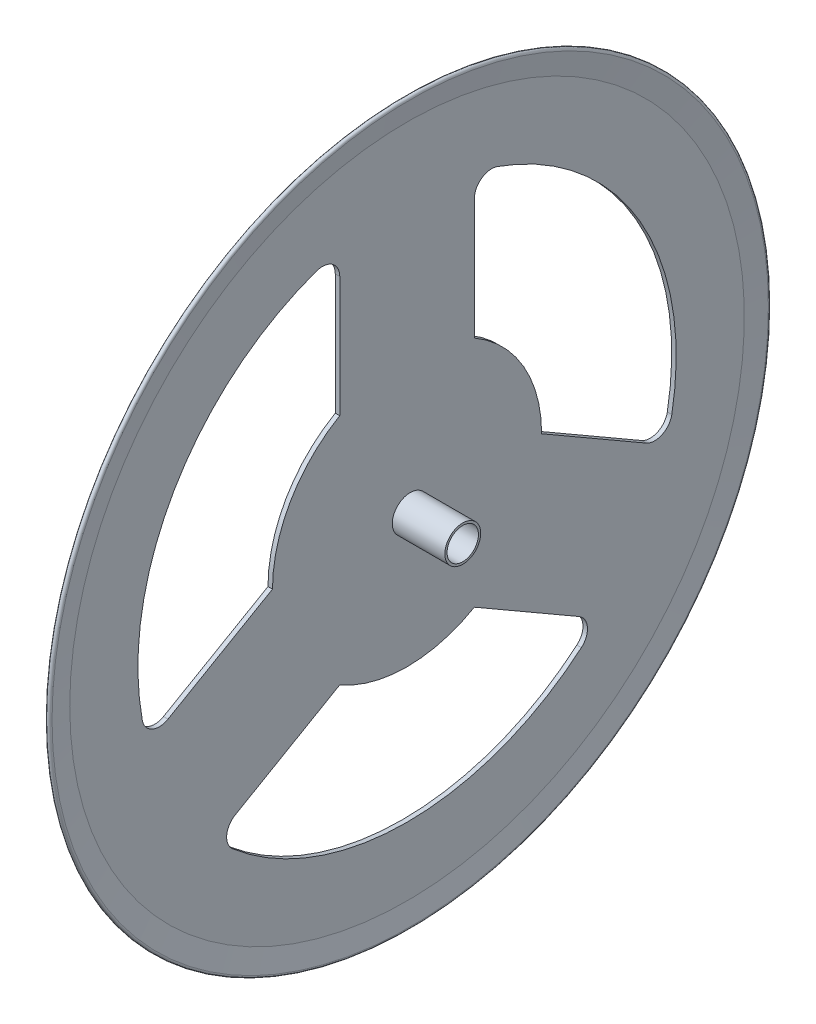
ISO-10303-21;
HEADER;
FILE_DESCRIPTION(('STEP AP214'),'2;1');
FILE_NAME('part.step','',(''),(''),'','','');
FILE_SCHEMA(('AUTOMOTIVE_DESIGN { 1 0 10303 214 1 1 1 1 }'));
ENDSEC;
DATA;
#1=APPLICATION_CONTEXT('core data for automotive mechanical design processes');
#2=APPLICATION_PROTOCOL_DEFINITION('international standard','automotive_design',2000,#1);
#3=PRODUCT_CONTEXT('',#1,'mechanical');
#4=PRODUCT('Part','Part','',(#3));
#5=PRODUCT_RELATED_PRODUCT_CATEGORY('part','',(#4));
#6=PRODUCT_DEFINITION_FORMATION('','',#4);
#7=PRODUCT_DEFINITION_CONTEXT('part definition',#1,'design');
#8=PRODUCT_DEFINITION('design','',#6,#7);
#9=PRODUCT_DEFINITION_SHAPE('','',#8);
#10=(LENGTH_UNIT() NAMED_UNIT(*) SI_UNIT(.MILLI.,.METRE.));
#11=(NAMED_UNIT(*) PLANE_ANGLE_UNIT() SI_UNIT($,.RADIAN.));
#12=(NAMED_UNIT(*) SI_UNIT($,.STERADIAN.) SOLID_ANGLE_UNIT());
#13=UNCERTAINTY_MEASURE_WITH_UNIT(LENGTH_MEASURE(1.E-05),#10,'distance_accuracy_value','');
#14=(GEOMETRIC_REPRESENTATION_CONTEXT(3) GLOBAL_UNCERTAINTY_ASSIGNED_CONTEXT((#13)) GLOBAL_UNIT_ASSIGNED_CONTEXT((#10,
#11,#12)) REPRESENTATION_CONTEXT('',''));
#15=CARTESIAN_POINT('',(0.,0.,0.));
#16=DIRECTION('',(0.,0.,1.));
#17=DIRECTION('',(1.,0.,0.));
#18=AXIS2_PLACEMENT_3D('',#15,#16,#17);
#19=CARTESIAN_POINT('',(-20.6948129155199,0.,0.));
#20=DIRECTION('',(1.,0.,0.));
#21=DIRECTION('',(0.,0.,-1.));
#22=AXIS2_PLACEMENT_3D('',#19,#20,#21);
#23=PLANE('',#22);
#24=CARTESIAN_POINT('',(-20.6948129155199,0.,0.));
#25=DIRECTION('',(-1.,0.,0.));
#26=DIRECTION('',(0.,0.,1.));
#27=AXIS2_PLACEMENT_3D('',#24,#25,#26);
#28=CIRCLE('',#27,4.);
#29=CARTESIAN_POINT('',(-20.6948129155199,0.,4.));
#30=VERTEX_POINT('',#29);
#31=EDGE_CURVE('E55',#30,#30,#28,.T.);
#32=ORIENTED_EDGE('',*,*,#31,.T.);
#33=EDGE_LOOP('',(#32));
#34=FACE_BOUND('',#33,.T.);
#35=ADVANCED_FACE('F49',(#34),#23,.F.);
#36=CARTESIAN_POINT('',(-8.98270848845188,4.,0.));
#37=DIRECTION('',(-1.,0.,0.));
#38=DIRECTION('',(0.,0.,1.));
#39=AXIS2_PLACEMENT_3D('',#36,#37,#38);
#40=PLANE('',#39);
#41=CARTESIAN_POINT('',(-8.98270848845188,0.,0.));
#42=DIRECTION('',(1.,0.,0.));
#43=DIRECTION('',(0.,0.,-1.));
#44=AXIS2_PLACEMENT_3D('',#41,#42,#43);
#45=CIRCLE('',#44,3.5);
#46=CARTESIAN_POINT('',(-8.98270848845188,0.,-3.5));
#47=VERTEX_POINT('',#46);
#48=EDGE_CURVE('E63',#47,#47,#45,.T.);
#49=ORIENTED_EDGE('',*,*,#48,.F.);
#50=EDGE_LOOP('',(#49));
#51=FACE_BOUND('',#50,.T.);
#52=CARTESIAN_POINT('',(-8.98270848845188,0.,0.));
#53=DIRECTION('',(-1.,0.,0.));
#54=DIRECTION('',(0.,0.,1.));
#55=AXIS2_PLACEMENT_3D('',#52,#53,#54);
#56=CIRCLE('',#55,4.);
#57=CARTESIAN_POINT('',(-8.98270848845188,0.,4.));
#58=VERTEX_POINT('',#57);
#59=EDGE_CURVE('E11',#58,#58,#56,.T.);
#60=ORIENTED_EDGE('',*,*,#59,.F.);
#61=EDGE_LOOP('',(#60));
#62=FACE_BOUND('',#61,.T.);
#63=ADVANCED_FACE('F71',(#51,#62),#40,.F.);
#64=CARTESIAN_POINT('',(-20.6948129155199,0.,0.));
#65=DIRECTION('',(-1.,0.,0.));
#66=DIRECTION('',(0.,0.,1.));
#67=AXIS2_PLACEMENT_3D('',#64,#65,#66);
#68=CYLINDRICAL_SURFACE('',#67,4.);
#69=ORIENTED_EDGE('',*,*,#31,.F.);
#70=EDGE_LOOP('',(#69));
#71=FACE_BOUND('',#70,.T.);
#72=ORIENTED_EDGE('',*,*,#59,.T.);
#73=EDGE_LOOP('',(#72));
#74=FACE_BOUND('',#73,.T.);
#75=ADVANCED_FACE('F74',(#71,#74),#68,.T.);
#76=CARTESIAN_POINT('',(-16.9827084884519,0.,0.));
#77=DIRECTION('',(1.,0.,0.));
#78=DIRECTION('',(0.,0.,-1.));
#79=AXIS2_PLACEMENT_3D('',#76,#77,#78);
#80=CYLINDRICAL_SURFACE('',#79,3.5);
#81=CARTESIAN_POINT('',(-16.9827084884519,0.,0.));
#82=DIRECTION('',(1.,0.,0.));
#83=DIRECTION('',(0.,0.,-1.));
#84=AXIS2_PLACEMENT_3D('',#81,#82,#83);
#85=CIRCLE('',#84,3.5);
#86=CARTESIAN_POINT('',(-16.9827084884519,0.,-3.5));
#87=VERTEX_POINT('',#86);
#88=EDGE_CURVE('E59',#87,#87,#85,.T.);
#89=ORIENTED_EDGE('',*,*,#88,.F.);
#90=EDGE_LOOP('',(#89));
#91=FACE_BOUND('',#90,.T.);
#92=ORIENTED_EDGE('',*,*,#48,.T.);
#93=EDGE_LOOP('',(#92));
#94=FACE_BOUND('',#93,.T.);
#95=ADVANCED_FACE('F69',(#91,#94),#80,.F.);
#96=CARTESIAN_POINT('',(-16.9827084884519,0.,0.));
#97=DIRECTION('',(1.,0.,0.));
#98=DIRECTION('',(0.,0.,-1.));
#99=AXIS2_PLACEMENT_3D('',#96,#97,#98);
#100=PLANE('',#99);
#101=ORIENTED_EDGE('',*,*,#88,.T.);
#102=EDGE_LOOP('',(#101));
#103=FACE_BOUND('',#102,.T.);
#104=ADVANCED_FACE('F84',(#103),#100,.T.);
#105=CLOSED_SHELL('',(#35,#63,#75,#95,#104));
#106=MANIFOLD_SOLID_BREP('B2',#105);
#107=CARTESIAN_POINT('',(-22.4009291772987,0.,0.));
#108=DIRECTION('',(1.,0.,0.));
#109=DIRECTION('',(0.,0.,-1.));
#110=AXIS2_PLACEMENT_3D('',#107,#108,#109);
#111=PLANE('',#110);
#112=CARTESIAN_POINT('',(-22.4009291772987,-42.7725931523001,36.3547898222074));
#113=DIRECTION('',(1.,0.,0.));
#114=DIRECTION('',(0.,0.,-1.));
#115=AXIS2_PLACEMENT_3D('',#112,#113,#114);
#116=CIRCLE('',#115,3.86475734452497);
#117=CARTESIAN_POINT('',(-22.4009291772987,-45.7173687640184,38.8577172939271));
#118=VERTEX_POINT('',#117);
#119=CARTESIAN_POINT('',(-22.4009291772987,-39.4256151124789,38.2871684944699));
#120=VERTEX_POINT('',#119);
#121=EDGE_CURVE('E252',#118,#120,#116,.F.);
#122=ORIENTED_EDGE('',*,*,#121,.F.);
#123=CARTESIAN_POINT('',(-22.4009291772987,0.,0.));
#124=DIRECTION('',(1.,0.,0.));
#125=DIRECTION('',(0.,0.,-1.));
#126=AXIS2_PLACEMENT_3D('',#123,#124,#125);
#127=CIRCLE('',#126,60.);
#128=CARTESIAN_POINT('',(-22.4009291772987,-45.7173687640189,-38.8577172939264));
#129=VERTEX_POINT('',#128);
#130=EDGE_CURVE('E264',#118,#129,#127,.T.);
#131=ORIENTED_EDGE('',*,*,#130,.T.);
#132=CARTESIAN_POINT('',(-22.4009291772987,-42.7725931523006,-36.3547898222068));
#133=DIRECTION('',(1.,0.,0.));
#134=DIRECTION('',(0.,0.,-1.));
#135=AXIS2_PLACEMENT_3D('',#132,#133,#134);
#136=CIRCLE('',#135,3.86475734452498);
#137=CARTESIAN_POINT('',(-22.4009291772987,-39.4256151124795,-38.2871684944693));
#138=VERTEX_POINT('',#137);
#139=EDGE_CURVE('E146',#129,#138,#136,.T.);
#140=ORIENTED_EDGE('',*,*,#139,.T.);
#141=DIRECTION('',(0.,0.500000000000004,0.866025403784436));
#142=VECTOR('',#141,1.);
#143=CARTESIAN_POINT('',(-22.4009291772987,-12.9903810567665,7.50000000000006));
#144=LINE('',#143,#142);
#145=CARTESIAN_POINT('',(-22.4009291772987,-25.9807621135332,-14.9999999999999));
#146=VERTEX_POINT('',#145);
#147=EDGE_CURVE('E282',#138,#146,#144,.T.);
#148=ORIENTED_EDGE('',*,*,#147,.T.);
#149=CARTESIAN_POINT('',(-22.4009291772987,0.,0.));
#150=DIRECTION('',(1.,0.,0.));
#151=DIRECTION('',(0.,0.,-1.));
#152=AXIS2_PLACEMENT_3D('',#149,#150,#151);
#153=CIRCLE('',#152,30.);
#154=CARTESIAN_POINT('',(-22.4009291772987,-25.980762113533,15.0000000000002));
#155=VERTEX_POINT('',#154);
#156=EDGE_CURVE('E286',#155,#146,#153,.T.);
#157=ORIENTED_EDGE('',*,*,#156,.F.);
#158=DIRECTION('',(0.,0.499999999999992,-0.866025403784443));
#159=VECTOR('',#158,1.);
#160=CARTESIAN_POINT('',(-22.4009291772987,-12.9903810567666,-7.49999999999988));
#161=LINE('',#160,#159);
#162=EDGE_CURVE('E261',#120,#155,#161,.T.);
#163=ORIENTED_EDGE('',*,*,#162,.F.);
#164=EDGE_LOOP('',(#122,#131,#140,#148,#157,#163));
#165=FACE_BOUND('',#164,.T.);
#166=CARTESIAN_POINT('',(-22.4009291772987,52.8704681114254,18.864757344525));
#167=DIRECTION('',(1.,0.,0.));
#168=DIRECTION('',(0.,0.,-1.));
#169=AXIS2_PLACEMENT_3D('',#166,#167,#168);
#170=CIRCLE('',#169,3.86475734452497);
#171=CARTESIAN_POINT('',(-22.4009291772987,56.5104546916237,20.1635440968581));
#172=VERTEX_POINT('',#171);
#173=CARTESIAN_POINT('',(-22.4009291772987,52.8704681114254,15.));
#174=VERTEX_POINT('',#173);
#175=EDGE_CURVE('E404',#172,#174,#170,.F.);
#176=ORIENTED_EDGE('',*,*,#175,.F.);
#177=CARTESIAN_POINT('',(-22.4009291772987,0.,0.));
#178=DIRECTION('',(1.,0.,0.));
#179=DIRECTION('',(0.,0.,-1.));
#180=AXIS2_PLACEMENT_3D('',#177,#178,#179);
#181=CIRCLE('',#180,60.);
#182=CARTESIAN_POINT('',(-22.4009291772987,-10.7930859276045,59.0212613907848));
#183=VERTEX_POINT('',#182);
#184=EDGE_CURVE('E385',#172,#183,#181,.T.);
#185=ORIENTED_EDGE('',*,*,#184,.T.);
#186=CARTESIAN_POINT('',(-22.4009291772987,-10.0978749591245,55.2195471667321));
#187=DIRECTION('',(1.,0.,0.));
#188=DIRECTION('',(0.,0.,-1.));
#189=AXIS2_PLACEMENT_3D('',#186,#187,#188);
#190=CIRCLE('',#189,3.86475734452497);
#191=CARTESIAN_POINT('',(-22.4009291772987,-13.4448529989456,53.2871684944696));
#192=VERTEX_POINT('',#191);
#193=EDGE_CURVE('E389',#183,#192,#190,.T.);
#194=ORIENTED_EDGE('',*,*,#193,.T.);
#195=DIRECTION('',(0.,0.499999999999992,-0.866025403784443));
#196=VECTOR('',#195,1.);
#197=CARTESIAN_POINT('',(-22.4009291772987,12.9903810567666,7.49999999999987));
#198=LINE('',#197,#196);
#199=CARTESIAN_POINT('',(-22.4009291772987,2.81025203108243E-13,30.));
#200=VERTEX_POINT('',#199);
#201=EDGE_CURVE('E394',#192,#200,#198,.T.);
#202=ORIENTED_EDGE('',*,*,#201,.T.);
#203=CARTESIAN_POINT('',(-22.4009291772987,0.,0.));
#204=DIRECTION('',(1.,0.,0.));
#205=DIRECTION('',(0.,0.,-1.));
#206=AXIS2_PLACEMENT_3D('',#203,#204,#205);
#207=CIRCLE('',#206,30.);
#208=CARTESIAN_POINT('',(-22.4009291772987,25.9807621135332,15.));
#209=VERTEX_POINT('',#208);
#210=EDGE_CURVE('E398',#209,#200,#207,.T.);
#211=ORIENTED_EDGE('',*,*,#210,.F.);
#212=DIRECTION('',(0.,-1.,0.));
#213=VECTOR('',#212,1.);
#214=CARTESIAN_POINT('',(-22.4009291772987,0.,15.));
#215=LINE('',#214,#213);
#216=EDGE_CURVE('E401',#174,#209,#215,.T.);
#217=ORIENTED_EDGE('',*,*,#216,.F.);
#218=EDGE_LOOP('',(#176,#185,#194,#202,#211,#217));
#219=FACE_BOUND('',#218,.T.);
#220=CARTESIAN_POINT('',(-22.4009291772987,0.,0.));
#221=DIRECTION('',(-1.,0.,0.));
#222=DIRECTION('',(0.,0.,1.));
#223=AXIS2_PLACEMENT_3D('',#220,#221,#222);
#224=CIRCLE('',#223,75.2706740120756);
#225=CARTESIAN_POINT('',(-22.4009291772987,0.,75.2706740120756));
#226=VERTEX_POINT('',#225);
#227=EDGE_CURVE('E47',#226,#226,#224,.T.);
#228=ORIENTED_EDGE('',*,*,#227,.T.);
#229=EDGE_LOOP('',(#228));
#230=FACE_BOUND('',#229,.T.);
#231=CARTESIAN_POINT('',(-22.4009291772987,-10.0978749591253,-55.2195471667319));
#232=DIRECTION('',(1.,0.,0.));
#233=DIRECTION('',(0.,0.,-1.));
#234=AXIS2_PLACEMENT_3D('',#231,#232,#233);
#235=CIRCLE('',#234,3.86475734452497);
#236=CARTESIAN_POINT('',(-22.4009291772987,-10.7930859276053,-59.0212613907847));
#237=VERTEX_POINT('',#236);
#238=CARTESIAN_POINT('',(-22.4009291772987,-13.4448529989464,-53.2871684944694));
#239=VERTEX_POINT('',#238);
#240=EDGE_CURVE('E323',#237,#239,#235,.F.);
#241=ORIENTED_EDGE('',*,*,#240,.F.);
#242=CARTESIAN_POINT('',(-22.4009291772987,0.,0.));
#243=DIRECTION('',(1.,0.,0.));
#244=DIRECTION('',(0.,0.,-1.));
#245=AXIS2_PLACEMENT_3D('',#242,#243,#244);
#246=CIRCLE('',#245,60.);
#247=CARTESIAN_POINT('',(-22.4009291772987,56.5104546916237,-20.1635440968581));
#248=VERTEX_POINT('',#247);
#249=EDGE_CURVE('E326',#237,#248,#246,.T.);
#250=ORIENTED_EDGE('',*,*,#249,.T.);
#251=CARTESIAN_POINT('',(-22.4009291772987,52.8704681114254,-18.864757344525));
#252=DIRECTION('',(1.,0.,0.));
#253=DIRECTION('',(0.,0.,-1.));
#254=AXIS2_PLACEMENT_3D('',#251,#252,#253);
#255=CIRCLE('',#254,3.86475734452497);
#256=CARTESIAN_POINT('',(-22.4009291772987,52.8704681114254,-15.));
#257=VERTEX_POINT('',#256);
#258=EDGE_CURVE('E138',#248,#257,#255,.T.);
#259=ORIENTED_EDGE('',*,*,#258,.T.);
#260=DIRECTION('',(0.,-1.,0.));
#261=VECTOR('',#260,1.);
#262=CARTESIAN_POINT('',(-22.4009291772987,0.,-15.));
#263=LINE('',#262,#261);
#264=CARTESIAN_POINT('',(-22.4009291772987,25.9807621135332,-15.));
#265=VERTEX_POINT('',#264);
#266=EDGE_CURVE('E333',#257,#265,#263,.T.);
#267=ORIENTED_EDGE('',*,*,#266,.T.);
#268=CARTESIAN_POINT('',(-22.4009291772987,0.,0.));
#269=DIRECTION('',(1.,0.,0.));
#270=DIRECTION('',(0.,0.,-1.));
#271=AXIS2_PLACEMENT_3D('',#268,#269,#270);
#272=CIRCLE('',#271,30.);
#273=CARTESIAN_POINT('',(-22.4009291772987,-1.40512601554121E-13,-30.));
#274=VERTEX_POINT('',#273);
#275=EDGE_CURVE('E337',#274,#265,#272,.T.);
#276=ORIENTED_EDGE('',*,*,#275,.F.);
#277=DIRECTION('',(0.,0.500000000000004,0.866025403784436));
#278=VECTOR('',#277,1.);
#279=CARTESIAN_POINT('',(-22.4009291772987,12.9903810567665,-7.50000000000005));
#280=LINE('',#279,#278);
#281=EDGE_CURVE('E340',#239,#274,#280,.T.);
#282=ORIENTED_EDGE('',*,*,#281,.F.);
#283=EDGE_LOOP('',(#241,#250,#259,#267,#276,#282));
#284=FACE_BOUND('',#283,.T.);
#285=ADVANCED_FACE('F123',(#165,#219,#230,#284),#111,.F.);
#286=CARTESIAN_POINT('',(-21.4009291772987,0.,0.));
#287=DIRECTION('',(-1.,0.,0.));
#288=DIRECTION('',(0.,0.,1.));
#289=AXIS2_PLACEMENT_3D('',#286,#287,#288);
#290=PLANE('',#289);
#291=CARTESIAN_POINT('',(-21.4009291772987,-42.7725931523001,36.3547898222074));
#292=DIRECTION('',(1.,0.,0.));
#293=DIRECTION('',(0.,0.,-1.));
#294=AXIS2_PLACEMENT_3D('',#291,#292,#293);
#295=CIRCLE('',#294,3.86475734452497);
#296=CARTESIAN_POINT('',(-21.4009291772987,-45.7173687640184,38.8577172939271));
#297=VERTEX_POINT('',#296);
#298=CARTESIAN_POINT('',(-21.4009291772987,-39.4256151124789,38.2871684944699));
#299=VERTEX_POINT('',#298);
#300=EDGE_CURVE('E255',#297,#299,#295,.F.);
#301=ORIENTED_EDGE('',*,*,#300,.T.);
#302=DIRECTION('',(0.,0.499999999999992,-0.866025403784443));
#303=VECTOR('',#302,1.);
#304=CARTESIAN_POINT('',(-21.4009291772987,-12.9903810567666,-7.49999999999988));
#305=LINE('',#304,#303);
#306=CARTESIAN_POINT('',(-21.4009291772987,-25.980762113533,15.0000000000002));
#307=VERTEX_POINT('',#306);
#308=EDGE_CURVE('E273',#299,#307,#305,.T.);
#309=ORIENTED_EDGE('',*,*,#308,.T.);
#310=CARTESIAN_POINT('',(-21.4009291772987,0.,0.));
#311=DIRECTION('',(1.,0.,0.));
#312=DIRECTION('',(0.,0.,-1.));
#313=AXIS2_PLACEMENT_3D('',#310,#311,#312);
#314=CIRCLE('',#313,30.);
#315=CARTESIAN_POINT('',(-21.4009291772987,-25.9807621135332,-14.9999999999999));
#316=VERTEX_POINT('',#315);
#317=EDGE_CURVE('E277',#307,#316,#314,.T.);
#318=ORIENTED_EDGE('',*,*,#317,.T.);
#319=DIRECTION('',(0.,0.500000000000004,0.866025403784436));
#320=VECTOR('',#319,1.);
#321=CARTESIAN_POINT('',(-21.4009291772987,-12.9903810567665,7.50000000000006));
#322=LINE('',#321,#320);
#323=CARTESIAN_POINT('',(-21.4009291772987,-39.4256151124795,-38.2871684944693));
#324=VERTEX_POINT('',#323);
#325=EDGE_CURVE('E301',#324,#316,#322,.T.);
#326=ORIENTED_EDGE('',*,*,#325,.F.);
#327=CARTESIAN_POINT('',(-21.4009291772987,-42.7725931523006,-36.3547898222068));
#328=DIRECTION('',(1.,0.,0.));
#329=DIRECTION('',(0.,0.,-1.));
#330=AXIS2_PLACEMENT_3D('',#327,#328,#329);
#331=CIRCLE('',#330,3.86475734452498);
#332=CARTESIAN_POINT('',(-21.4009291772987,-45.7173687640189,-38.8577172939264));
#333=VERTEX_POINT('',#332);
#334=EDGE_CURVE('E297',#333,#324,#331,.T.);
#335=ORIENTED_EDGE('',*,*,#334,.F.);
#336=CARTESIAN_POINT('',(-21.4009291772987,0.,0.));
#337=DIRECTION('',(1.,0.,0.));
#338=DIRECTION('',(0.,0.,-1.));
#339=AXIS2_PLACEMENT_3D('',#336,#337,#338);
#340=CIRCLE('',#339,60.);
#341=EDGE_CURVE('E293',#297,#333,#340,.T.);
#342=ORIENTED_EDGE('',*,*,#341,.F.);
#343=EDGE_LOOP('',(#301,#309,#318,#326,#335,#342));
#344=FACE_BOUND('',#343,.T.);
#345=CARTESIAN_POINT('',(-21.4009291772987,-10.0978749591245,55.2195471667321));
#346=DIRECTION('',(1.,0.,0.));
#347=DIRECTION('',(0.,0.,-1.));
#348=AXIS2_PLACEMENT_3D('',#345,#346,#347);
#349=CIRCLE('',#348,3.86475734452497);
#350=CARTESIAN_POINT('',(-21.4009291772987,-10.7930859276045,59.0212613907848));
#351=VERTEX_POINT('',#350);
#352=CARTESIAN_POINT('',(-21.4009291772987,-13.4448529989456,53.2871684944696));
#353=VERTEX_POINT('',#352);
#354=EDGE_CURVE('E410',#351,#353,#349,.T.);
#355=ORIENTED_EDGE('',*,*,#354,.F.);
#356=CARTESIAN_POINT('',(-21.4009291772987,0.,0.));
#357=DIRECTION('',(1.,0.,0.));
#358=DIRECTION('',(0.,0.,-1.));
#359=AXIS2_PLACEMENT_3D('',#356,#357,#358);
#360=CIRCLE('',#359,60.);
#361=CARTESIAN_POINT('',(-21.4009291772987,56.5104546916237,20.1635440968581));
#362=VERTEX_POINT('',#361);
#363=EDGE_CURVE('E311',#362,#351,#360,.T.);
#364=ORIENTED_EDGE('',*,*,#363,.F.);
#365=CARTESIAN_POINT('',(-21.4009291772987,52.8704681114254,18.864757344525));
#366=DIRECTION('',(1.,0.,0.));
#367=DIRECTION('',(0.,0.,-1.));
#368=AXIS2_PLACEMENT_3D('',#365,#366,#367);
#369=CIRCLE('',#368,3.86475734452497);
#370=CARTESIAN_POINT('',(-21.4009291772987,52.8704681114254,15.));
#371=VERTEX_POINT('',#370);
#372=EDGE_CURVE('E390',#362,#371,#369,.F.);
#373=ORIENTED_EDGE('',*,*,#372,.T.);
#374=DIRECTION('',(0.,-1.,0.));
#375=VECTOR('',#374,1.);
#376=CARTESIAN_POINT('',(-21.4009291772987,0.,15.));
#377=LINE('',#376,#375);
#378=CARTESIAN_POINT('',(-21.4009291772987,25.9807621135332,15.));
#379=VERTEX_POINT('',#378);
#380=EDGE_CURVE('E422',#371,#379,#377,.T.);
#381=ORIENTED_EDGE('',*,*,#380,.T.);
#382=CARTESIAN_POINT('',(-21.4009291772987,0.,0.));
#383=DIRECTION('',(1.,0.,0.));
#384=DIRECTION('',(0.,0.,-1.));
#385=AXIS2_PLACEMENT_3D('',#382,#383,#384);
#386=CIRCLE('',#385,30.);
#387=CARTESIAN_POINT('',(-21.4009291772987,2.81025203108243E-13,30.));
#388=VERTEX_POINT('',#387);
#389=EDGE_CURVE('E418',#379,#388,#386,.T.);
#390=ORIENTED_EDGE('',*,*,#389,.T.);
#391=DIRECTION('',(0.,0.499999999999992,-0.866025403784443));
#392=VECTOR('',#391,1.);
#393=CARTESIAN_POINT('',(-21.4009291772987,12.9903810567666,7.49999999999987));
#394=LINE('',#393,#392);
#395=EDGE_CURVE('E414',#353,#388,#394,.T.);
#396=ORIENTED_EDGE('',*,*,#395,.F.);
#397=EDGE_LOOP('',(#355,#364,#373,#381,#390,#396));
#398=FACE_BOUND('',#397,.T.);
#399=CARTESIAN_POINT('',(-21.4009291772987,0.,0.));
#400=DIRECTION('',(-1.,0.,0.));
#401=DIRECTION('',(0.,0.,1.));
#402=AXIS2_PLACEMENT_3D('',#399,#400,#401);
#403=CIRCLE('',#402,75.19525661401);
#404=CARTESIAN_POINT('',(-21.4009291772987,0.,75.19525661401));
#405=VERTEX_POINT('',#404);
#406=EDGE_CURVE('E432',#405,#405,#403,.T.);
#407=ORIENTED_EDGE('',*,*,#406,.F.);
#408=EDGE_LOOP('',(#407));
#409=FACE_BOUND('',#408,.T.);
#410=CARTESIAN_POINT('',(-21.4009291772987,-10.0978749591253,-55.2195471667319));
#411=DIRECTION('',(1.,0.,0.));
#412=DIRECTION('',(0.,0.,-1.));
#413=AXIS2_PLACEMENT_3D('',#410,#411,#412);
#414=CIRCLE('',#413,3.86475734452497);
#415=CARTESIAN_POINT('',(-21.4009291772987,-10.7930859276053,-59.0212613907847));
#416=VERTEX_POINT('',#415);
#417=CARTESIAN_POINT('',(-21.4009291772987,-13.4448529989464,-53.2871684944694));
#418=VERTEX_POINT('',#417);
#419=EDGE_CURVE('E344',#416,#418,#414,.F.);
#420=ORIENTED_EDGE('',*,*,#419,.T.);
#421=DIRECTION('',(0.,0.500000000000004,0.866025403784436));
#422=VECTOR('',#421,1.);
#423=CARTESIAN_POINT('',(-21.4009291772987,12.9903810567665,-7.50000000000005));
#424=LINE('',#423,#422);
#425=CARTESIAN_POINT('',(-21.4009291772987,-1.40512601554121E-13,-30.));
#426=VERTEX_POINT('',#425);
#427=EDGE_CURVE('E327',#418,#426,#424,.T.);
#428=ORIENTED_EDGE('',*,*,#427,.T.);
#429=CARTESIAN_POINT('',(-21.4009291772987,0.,0.));
#430=DIRECTION('',(1.,0.,0.));
#431=DIRECTION('',(0.,0.,-1.));
#432=AXIS2_PLACEMENT_3D('',#429,#430,#431);
#433=CIRCLE('',#432,30.);
#434=CARTESIAN_POINT('',(-21.4009291772987,25.9807621135332,-15.));
#435=VERTEX_POINT('',#434);
#436=EDGE_CURVE('E360',#426,#435,#433,.T.);
#437=ORIENTED_EDGE('',*,*,#436,.T.);
#438=DIRECTION('',(0.,-1.,0.));
#439=VECTOR('',#438,1.);
#440=CARTESIAN_POINT('',(-21.4009291772987,0.,-15.));
#441=LINE('',#440,#439);
#442=CARTESIAN_POINT('',(-21.4009291772987,52.8704681114254,-15.));
#443=VERTEX_POINT('',#442);
#444=EDGE_CURVE('E356',#443,#435,#441,.T.);
#445=ORIENTED_EDGE('',*,*,#444,.F.);
#446=CARTESIAN_POINT('',(-21.4009291772987,52.8704681114254,-18.864757344525));
#447=DIRECTION('',(1.,0.,0.));
#448=DIRECTION('',(0.,0.,-1.));
#449=AXIS2_PLACEMENT_3D('',#446,#447,#448);
#450=CIRCLE('',#449,3.86475734452497);
#451=CARTESIAN_POINT('',(-21.4009291772987,56.5104546916237,-20.1635440968581));
#452=VERTEX_POINT('',#451);
#453=EDGE_CURVE('E352',#452,#443,#450,.T.);
#454=ORIENTED_EDGE('',*,*,#453,.F.);
#455=CARTESIAN_POINT('',(-21.4009291772987,0.,0.));
#456=DIRECTION('',(1.,0.,0.));
#457=DIRECTION('',(0.,0.,-1.));
#458=AXIS2_PLACEMENT_3D('',#455,#456,#457);
#459=CIRCLE('',#458,60.);
#460=EDGE_CURVE('E348',#416,#452,#459,.T.);
#461=ORIENTED_EDGE('',*,*,#460,.F.);
#462=EDGE_LOOP('',(#420,#428,#437,#445,#454,#461));
#463=FACE_BOUND('',#462,.T.);
#464=ADVANCED_FACE('F473',(#344,#398,#409,#463),#290,.F.);
#465=CARTESIAN_POINT('',(-21.6835016835017,0.,0.));
#466=DIRECTION('',(1.,0.,0.));
#467=DIRECTION('',(0.,0.,-1.));
#468=AXIS2_PLACEMENT_3D('',#465,#466,#467);
#469=CONICAL_SURFACE('',#468,80.,1.42024653059326);
#470=ORIENTED_EDGE('',*,*,#227,.F.);
#471=EDGE_LOOP('',(#470));
#472=FACE_BOUND('',#471,.T.);
#473=CARTESIAN_POINT('',(-21.6835016835017,0.,0.));
#474=DIRECTION('',(-1.,0.,0.));
#475=DIRECTION('',(0.,0.,1.));
#476=AXIS2_PLACEMENT_3D('',#473,#474,#475);
#477=CIRCLE('',#476,80.);
#478=CARTESIAN_POINT('',(-21.6835016835017,0.,80.));
#479=VERTEX_POINT('',#478);
#480=EDGE_CURVE('E131',#479,#479,#477,.T.);
#481=ORIENTED_EDGE('',*,*,#480,.T.);
#482=EDGE_LOOP('',(#481));
#483=FACE_BOUND('',#482,.T.);
#484=ADVANCED_FACE('F458',(#472,#483),#469,.T.);
#485=CARTESIAN_POINT('',(-21.1891572995108,0.,0.));
#486=DIRECTION('',(-1.,0.,0.));
#487=DIRECTION('',(0.,0.,1.));
#488=AXIS2_PLACEMENT_3D('',#485,#486,#487);
#489=TOROIDAL_SURFACE('',#488,79.9250091337783,0.500000000000003);
#490=ORIENTED_EDGE('',*,*,#480,.F.);
#491=EDGE_LOOP('',(#490));
#492=FACE_BOUND('',#491,.T.);
#493=CARTESIAN_POINT('',(-20.6948129155199,0.,0.));
#494=DIRECTION('',(-1.,0.,0.));
#495=DIRECTION('',(0.,0.,1.));
#496=AXIS2_PLACEMENT_3D('',#493,#494,#495);
#497=CIRCLE('',#496,79.8500182675566);
#498=CARTESIAN_POINT('',(-20.6948129155199,0.,79.8500182675566));
#499=VERTEX_POINT('',#498);
#500=EDGE_CURVE('E451',#499,#499,#497,.T.);
#501=ORIENTED_EDGE('',*,*,#500,.T.);
#502=EDGE_LOOP('',(#501));
#503=FACE_BOUND('',#502,.T.);
#504=ADVANCED_FACE('F460',(#492,#503),#489,.T.);
#505=CARTESIAN_POINT('',(-21.4009291772987,0.,0.));
#506=DIRECTION('',(1.,0.,0.));
#507=DIRECTION('',(0.,0.,-1.));
#508=AXIS2_PLACEMENT_3D('',#505,#506,#507);
#509=CONICAL_SURFACE('',#508,75.19525661401,1.42024653059326);
#510=ORIENTED_EDGE('',*,*,#500,.F.);
#511=EDGE_LOOP('',(#510));
#512=FACE_BOUND('',#511,.T.);
#513=ORIENTED_EDGE('',*,*,#406,.T.);
#514=EDGE_LOOP('',(#513));
#515=FACE_BOUND('',#514,.T.);
#516=ADVANCED_FACE('F463',(#512,#515),#509,.F.);
#517=CARTESIAN_POINT('',(-22.4009291772987,0.,0.));
#518=DIRECTION('',(1.,0.,0.));
#519=DIRECTION('',(0.,0.,-1.));
#520=AXIS2_PLACEMENT_3D('',#517,#518,#519);
#521=CYLINDRICAL_SURFACE('',#520,60.);
#522=ORIENTED_EDGE('',*,*,#363,.T.);
#523=DIRECTION('',(1.,0.,0.));
#524=VECTOR('',#523,1.);
#525=CARTESIAN_POINT('',(-22.4009291772987,-10.7930859276045,59.0212613907848));
#526=LINE('',#525,#524);
#527=EDGE_CURVE('E407',#183,#351,#526,.T.);
#528=ORIENTED_EDGE('',*,*,#527,.F.);
#529=ORIENTED_EDGE('',*,*,#184,.F.);
#530=DIRECTION('',(1.,0.,0.));
#531=VECTOR('',#530,1.);
#532=CARTESIAN_POINT('',(-22.4009291772987,56.5104546916237,20.1635440968581));
#533=LINE('',#532,#531);
#534=EDGE_CURVE('E429',#172,#362,#533,.T.);
#535=ORIENTED_EDGE('',*,*,#534,.T.);
#536=EDGE_LOOP('',(#522,#528,#529,#535));
#537=FACE_BOUND('',#536,.T.);
#538=ADVANCED_FACE('F469',(#537),#521,.F.);
#539=CARTESIAN_POINT('',(-22.4009291772987,52.8704681114254,18.864757344525));
#540=DIRECTION('',(1.,0.,0.));
#541=DIRECTION('',(0.,0.,-1.));
#542=AXIS2_PLACEMENT_3D('',#539,#540,#541);
#543=CYLINDRICAL_SURFACE('',#542,3.86475734452497);
#544=ORIENTED_EDGE('',*,*,#372,.F.);
#545=ORIENTED_EDGE('',*,*,#534,.F.);
#546=ORIENTED_EDGE('',*,*,#175,.T.);
#547=DIRECTION('',(1.,0.,0.));
#548=VECTOR('',#547,1.);
#549=CARTESIAN_POINT('',(-22.4009291772987,52.8704681114254,15.));
#550=LINE('',#549,#548);
#551=EDGE_CURVE('E433',#174,#371,#550,.T.);
#552=ORIENTED_EDGE('',*,*,#551,.T.);
#553=EDGE_LOOP('',(#544,#545,#546,#552));
#554=FACE_BOUND('',#553,.T.);
#555=ADVANCED_FACE('F537',(#554),#543,.F.);
#556=CARTESIAN_POINT('',(-22.4009291772987,0.,15.));
#557=DIRECTION('',(0.,0.,1.));
#558=DIRECTION('',(0.,-1.,0.));
#559=AXIS2_PLACEMENT_3D('',#556,#557,#558);
#560=PLANE('',#559);
#561=ORIENTED_EDGE('',*,*,#380,.F.);
#562=ORIENTED_EDGE('',*,*,#551,.F.);
#563=ORIENTED_EDGE('',*,*,#216,.T.);
#564=DIRECTION('',(1.,0.,0.));
#565=VECTOR('',#564,1.);
#566=CARTESIAN_POINT('',(-22.4009291772987,25.9807621135332,15.));
#567=LINE('',#566,#565);
#568=EDGE_CURVE('E436',#209,#379,#567,.T.);
#569=ORIENTED_EDGE('',*,*,#568,.T.);
#570=EDGE_LOOP('',(#561,#562,#563,#569));
#571=FACE_BOUND('',#570,.T.);
#572=ADVANCED_FACE('F545',(#571),#560,.T.);
#573=CARTESIAN_POINT('',(-22.4009291772987,0.,0.));
#574=DIRECTION('',(1.,0.,0.));
#575=DIRECTION('',(0.,0.,-1.));
#576=AXIS2_PLACEMENT_3D('',#573,#574,#575);
#577=CYLINDRICAL_SURFACE('',#576,30.);
#578=ORIENTED_EDGE('',*,*,#389,.F.);
#579=ORIENTED_EDGE('',*,*,#568,.F.);
#580=ORIENTED_EDGE('',*,*,#210,.T.);
#581=DIRECTION('',(1.,0.,0.));
#582=VECTOR('',#581,1.);
#583=CARTESIAN_POINT('',(-22.4009291772987,2.81025203108243E-13,30.));
#584=LINE('',#583,#582);
#585=EDGE_CURVE('E439',#200,#388,#584,.T.);
#586=ORIENTED_EDGE('',*,*,#585,.T.);
#587=EDGE_LOOP('',(#578,#579,#580,#586));
#588=FACE_BOUND('',#587,.T.);
#589=ADVANCED_FACE('F553',(#588),#577,.T.);
#590=CARTESIAN_POINT('',(-22.4009291772987,12.9903810567666,7.49999999999987));
#591=DIRECTION('',(0.,-0.866025403784443,-0.499999999999992));
#592=DIRECTION('',(0.,0.499999999999992,-0.866025403784443));
#593=AXIS2_PLACEMENT_3D('',#590,#591,#592);
#594=PLANE('',#593);
#595=ORIENTED_EDGE('',*,*,#395,.T.);
#596=ORIENTED_EDGE('',*,*,#585,.F.);
#597=ORIENTED_EDGE('',*,*,#201,.F.);
#598=DIRECTION('',(1.,0.,0.));
#599=VECTOR('',#598,1.);
#600=CARTESIAN_POINT('',(-22.4009291772987,-13.4448529989456,53.2871684944696));
#601=LINE('',#600,#599);
#602=EDGE_CURVE('E442',#192,#353,#601,.T.);
#603=ORIENTED_EDGE('',*,*,#602,.T.);
#604=EDGE_LOOP('',(#595,#596,#597,#603));
#605=FACE_BOUND('',#604,.T.);
#606=ADVANCED_FACE('F561',(#605),#594,.F.);
#607=CARTESIAN_POINT('',(-22.4009291772987,-10.0978749591245,55.2195471667321));
#608=DIRECTION('',(1.,0.,0.));
#609=DIRECTION('',(0.,0.,-1.));
#610=AXIS2_PLACEMENT_3D('',#607,#608,#609);
#611=CYLINDRICAL_SURFACE('',#610,3.86475734452497);
#612=ORIENTED_EDGE('',*,*,#354,.T.);
#613=ORIENTED_EDGE('',*,*,#602,.F.);
#614=ORIENTED_EDGE('',*,*,#193,.F.);
#615=ORIENTED_EDGE('',*,*,#527,.T.);
#616=EDGE_LOOP('',(#612,#613,#614,#615));
#617=FACE_BOUND('',#616,.T.);
#618=ADVANCED_FACE('F569',(#617),#611,.F.);
#619=CARTESIAN_POINT('',(-22.4009291772987,-42.7725931523001,36.3547898222074));
#620=DIRECTION('',(1.,0.,0.));
#621=DIRECTION('',(0.,0.,-1.));
#622=AXIS2_PLACEMENT_3D('',#619,#620,#621);
#623=CYLINDRICAL_SURFACE('',#622,3.86475734452497);
#624=ORIENTED_EDGE('',*,*,#300,.F.);
#625=DIRECTION('',(1.,0.,0.));
#626=VECTOR('',#625,1.);
#627=CARTESIAN_POINT('',(-22.4009291772987,-45.7173687640184,38.8577172939271));
#628=LINE('',#627,#626);
#629=EDGE_CURVE('E247',#118,#297,#628,.T.);
#630=ORIENTED_EDGE('',*,*,#629,.F.);
#631=ORIENTED_EDGE('',*,*,#121,.T.);
#632=DIRECTION('',(1.,0.,0.));
#633=VECTOR('',#632,1.);
#634=CARTESIAN_POINT('',(-22.4009291772987,-39.4256151124789,38.2871684944699));
#635=LINE('',#634,#633);
#636=EDGE_CURVE('E308',#120,#299,#635,.T.);
#637=ORIENTED_EDGE('',*,*,#636,.T.);
#638=EDGE_LOOP('',(#624,#630,#631,#637));
#639=FACE_BOUND('',#638,.T.);
#640=ADVANCED_FACE('F249',(#639),#623,.F.);
#641=CARTESIAN_POINT('',(-22.4009291772987,-12.9903810567666,-7.49999999999988));
#642=DIRECTION('',(0.,-0.866025403784443,-0.499999999999992));
#643=DIRECTION('',(0.,0.499999999999992,-0.866025403784443));
#644=AXIS2_PLACEMENT_3D('',#641,#642,#643);
#645=PLANE('',#644);
#646=ORIENTED_EDGE('',*,*,#308,.F.);
#647=ORIENTED_EDGE('',*,*,#636,.F.);
#648=ORIENTED_EDGE('',*,*,#162,.T.);
#649=DIRECTION('',(1.,0.,0.));
#650=VECTOR('',#649,1.);
#651=CARTESIAN_POINT('',(-22.4009291772987,-25.980762113533,15.0000000000002));
#652=LINE('',#651,#650);
#653=EDGE_CURVE('E312',#155,#307,#652,.T.);
#654=ORIENTED_EDGE('',*,*,#653,.T.);
#655=EDGE_LOOP('',(#646,#647,#648,#654));
#656=FACE_BOUND('',#655,.T.);
#657=ADVANCED_FACE('F584',(#656),#645,.T.);
#658=CARTESIAN_POINT('',(-22.4009291772987,0.,0.));
#659=DIRECTION('',(1.,0.,0.));
#660=DIRECTION('',(0.,0.,-1.));
#661=AXIS2_PLACEMENT_3D('',#658,#659,#660);
#662=CYLINDRICAL_SURFACE('',#661,30.);
#663=ORIENTED_EDGE('',*,*,#317,.F.);
#664=ORIENTED_EDGE('',*,*,#653,.F.);
#665=ORIENTED_EDGE('',*,*,#156,.T.);
#666=DIRECTION('',(1.,0.,0.));
#667=VECTOR('',#666,1.);
#668=CARTESIAN_POINT('',(-22.4009291772987,-25.9807621135332,-14.9999999999999));
#669=LINE('',#668,#667);
#670=EDGE_CURVE('E315',#146,#316,#669,.T.);
#671=ORIENTED_EDGE('',*,*,#670,.T.);
#672=EDGE_LOOP('',(#663,#664,#665,#671));
#673=FACE_BOUND('',#672,.T.);
#674=ADVANCED_FACE('F591',(#673),#662,.T.);
#675=CARTESIAN_POINT('',(-22.4009291772987,-12.9903810567665,7.50000000000006));
#676=DIRECTION('',(0.,0.866025403784436,-0.500000000000004));
#677=DIRECTION('',(0.,0.500000000000004,0.866025403784436));
#678=AXIS2_PLACEMENT_3D('',#675,#676,#677);
#679=PLANE('',#678);
#680=ORIENTED_EDGE('',*,*,#325,.T.);
#681=ORIENTED_EDGE('',*,*,#670,.F.);
#682=ORIENTED_EDGE('',*,*,#147,.F.);
#683=DIRECTION('',(1.,0.,0.));
#684=VECTOR('',#683,1.);
#685=CARTESIAN_POINT('',(-22.4009291772987,-39.4256151124795,-38.2871684944693));
#686=LINE('',#685,#684);
#687=EDGE_CURVE('E318',#138,#324,#686,.T.);
#688=ORIENTED_EDGE('',*,*,#687,.T.);
#689=EDGE_LOOP('',(#680,#681,#682,#688));
#690=FACE_BOUND('',#689,.T.);
#691=ADVANCED_FACE('F599',(#690),#679,.F.);
#692=CARTESIAN_POINT('',(-22.4009291772987,-42.7725931523006,-36.3547898222068));
#693=DIRECTION('',(1.,0.,0.));
#694=DIRECTION('',(0.,0.,-1.));
#695=AXIS2_PLACEMENT_3D('',#692,#693,#694);
#696=CYLINDRICAL_SURFACE('',#695,3.86475734452498);
#697=ORIENTED_EDGE('',*,*,#334,.T.);
#698=ORIENTED_EDGE('',*,*,#687,.F.);
#699=ORIENTED_EDGE('',*,*,#139,.F.);
#700=DIRECTION('',(1.,0.,0.));
#701=VECTOR('',#700,1.);
#702=CARTESIAN_POINT('',(-22.4009291772987,-45.7173687640189,-38.8577172939264));
#703=LINE('',#702,#701);
#704=EDGE_CURVE('E260',#129,#333,#703,.T.);
#705=ORIENTED_EDGE('',*,*,#704,.T.);
#706=EDGE_LOOP('',(#697,#698,#699,#705));
#707=FACE_BOUND('',#706,.T.);
#708=ADVANCED_FACE('F607',(#707),#696,.F.);
#709=CARTESIAN_POINT('',(-22.4009291772987,0.,0.));
#710=DIRECTION('',(1.,0.,0.));
#711=DIRECTION('',(0.,0.,-1.));
#712=AXIS2_PLACEMENT_3D('',#709,#710,#711);
#713=CYLINDRICAL_SURFACE('',#712,60.);
#714=ORIENTED_EDGE('',*,*,#341,.T.);
#715=ORIENTED_EDGE('',*,*,#704,.F.);
#716=ORIENTED_EDGE('',*,*,#130,.F.);
#717=ORIENTED_EDGE('',*,*,#629,.T.);
#718=EDGE_LOOP('',(#714,#715,#716,#717));
#719=FACE_BOUND('',#718,.T.);
#720=ADVANCED_FACE('F265',(#719),#713,.F.);
#721=CARTESIAN_POINT('',(-22.4009291772987,-10.0978749591253,-55.2195471667319));
#722=DIRECTION('',(1.,0.,0.));
#723=DIRECTION('',(0.,0.,-1.));
#724=AXIS2_PLACEMENT_3D('',#721,#722,#723);
#725=CYLINDRICAL_SURFACE('',#724,3.86475734452497);
#726=ORIENTED_EDGE('',*,*,#419,.F.);
#727=DIRECTION('',(1.,0.,0.));
#728=VECTOR('',#727,1.);
#729=CARTESIAN_POINT('',(-22.4009291772987,-10.7930859276053,-59.0212613907847));
#730=LINE('',#729,#728);
#731=EDGE_CURVE('E343',#237,#416,#730,.T.);
#732=ORIENTED_EDGE('',*,*,#731,.F.);
#733=ORIENTED_EDGE('',*,*,#240,.T.);
#734=DIRECTION('',(1.,0.,0.));
#735=VECTOR('',#734,1.);
#736=CARTESIAN_POINT('',(-22.4009291772987,-13.4448529989464,-53.2871684944694));
#737=LINE('',#736,#735);
#738=EDGE_CURVE('E294',#239,#418,#737,.T.);
#739=ORIENTED_EDGE('',*,*,#738,.T.);
#740=EDGE_LOOP('',(#726,#732,#733,#739));
#741=FACE_BOUND('',#740,.T.);
#742=ADVANCED_FACE('F481',(#741),#725,.F.);
#743=CARTESIAN_POINT('',(-22.4009291772987,12.9903810567665,-7.50000000000005));
#744=DIRECTION('',(0.,0.866025403784436,-0.500000000000004));
#745=DIRECTION('',(0.,0.500000000000004,0.866025403784436));
#746=AXIS2_PLACEMENT_3D('',#743,#744,#745);
#747=PLANE('',#746);
#748=ORIENTED_EDGE('',*,*,#427,.F.);
#749=ORIENTED_EDGE('',*,*,#738,.F.);
#750=ORIENTED_EDGE('',*,*,#281,.T.);
#751=DIRECTION('',(1.,0.,0.));
#752=VECTOR('',#751,1.);
#753=CARTESIAN_POINT('',(-22.4009291772987,-1.40512601554121E-13,-30.));
#754=LINE('',#753,#752);
#755=EDGE_CURVE('E370',#274,#426,#754,.T.);
#756=ORIENTED_EDGE('',*,*,#755,.T.);
#757=EDGE_LOOP('',(#748,#749,#750,#756));
#758=FACE_BOUND('',#757,.T.);
#759=ADVANCED_FACE('F491',(#758),#747,.T.);
#760=CARTESIAN_POINT('',(-22.4009291772987,0.,0.));
#761=DIRECTION('',(1.,0.,0.));
#762=DIRECTION('',(0.,0.,-1.));
#763=AXIS2_PLACEMENT_3D('',#760,#761,#762);
#764=CYLINDRICAL_SURFACE('',#763,30.);
#765=ORIENTED_EDGE('',*,*,#436,.F.);
#766=ORIENTED_EDGE('',*,*,#755,.F.);
#767=ORIENTED_EDGE('',*,*,#275,.T.);
#768=DIRECTION('',(1.,0.,0.));
#769=VECTOR('',#768,1.);
#770=CARTESIAN_POINT('',(-22.4009291772987,25.9807621135332,-15.));
#771=LINE('',#770,#769);
#772=EDGE_CURVE('E373',#265,#435,#771,.T.);
#773=ORIENTED_EDGE('',*,*,#772,.T.);
#774=EDGE_LOOP('',(#765,#766,#767,#773));
#775=FACE_BOUND('',#774,.T.);
#776=ADVANCED_FACE('F495',(#775),#764,.T.);
#777=CARTESIAN_POINT('',(-22.4009291772987,0.,-15.));
#778=DIRECTION('',(0.,0.,1.));
#779=DIRECTION('',(0.,-1.,0.));
#780=AXIS2_PLACEMENT_3D('',#777,#778,#779);
#781=PLANE('',#780);
#782=ORIENTED_EDGE('',*,*,#444,.T.);
#783=ORIENTED_EDGE('',*,*,#772,.F.);
#784=ORIENTED_EDGE('',*,*,#266,.F.);
#785=DIRECTION('',(1.,0.,0.));
#786=VECTOR('',#785,1.);
#787=CARTESIAN_POINT('',(-22.4009291772987,52.8704681114254,-15.));
#788=LINE('',#787,#786);
#789=EDGE_CURVE('E376',#257,#443,#788,.T.);
#790=ORIENTED_EDGE('',*,*,#789,.T.);
#791=EDGE_LOOP('',(#782,#783,#784,#790));
#792=FACE_BOUND('',#791,.T.);
#793=ADVANCED_FACE('F499',(#792),#781,.F.);
#794=CARTESIAN_POINT('',(-22.4009291772987,52.8704681114254,-18.864757344525));
#795=DIRECTION('',(1.,0.,0.));
#796=DIRECTION('',(0.,0.,-1.));
#797=AXIS2_PLACEMENT_3D('',#794,#795,#796);
#798=CYLINDRICAL_SURFACE('',#797,3.86475734452497);
#799=ORIENTED_EDGE('',*,*,#453,.T.);
#800=ORIENTED_EDGE('',*,*,#789,.F.);
#801=ORIENTED_EDGE('',*,*,#258,.F.);
#802=DIRECTION('',(1.,0.,0.));
#803=VECTOR('',#802,1.);
#804=CARTESIAN_POINT('',(-22.4009291772987,56.5104546916237,-20.1635440968581));
#805=LINE('',#804,#803);
#806=EDGE_CURVE('E379',#248,#452,#805,.T.);
#807=ORIENTED_EDGE('',*,*,#806,.T.);
#808=EDGE_LOOP('',(#799,#800,#801,#807));
#809=FACE_BOUND('',#808,.T.);
#810=ADVANCED_FACE('F501',(#809),#798,.F.);
#811=CARTESIAN_POINT('',(-22.4009291772987,0.,0.));
#812=DIRECTION('',(1.,0.,0.));
#813=DIRECTION('',(0.,0.,-1.));
#814=AXIS2_PLACEMENT_3D('',#811,#812,#813);
#815=CYLINDRICAL_SURFACE('',#814,60.);
#816=ORIENTED_EDGE('',*,*,#460,.T.);
#817=ORIENTED_EDGE('',*,*,#806,.F.);
#818=ORIENTED_EDGE('',*,*,#249,.F.);
#819=ORIENTED_EDGE('',*,*,#731,.T.);
#820=EDGE_LOOP('',(#816,#817,#818,#819));
#821=FACE_BOUND('',#820,.T.);
#822=ADVANCED_FACE('F485',(#821),#815,.F.);
#823=CLOSED_SHELL('',(#285,#464,#484,#504,#516,#538,#555,#572,#589,#606,#618,#640,#657,#674,
#691,#708,#720,#742,#759,#776,#793,#810,#822));
#824=MANIFOLD_SOLID_BREP('B6',#823);
#825=ADVANCED_BREP_SHAPE_REPRESENTATION('',(#18,#106,#824),#14);
#826=SHAPE_DEFINITION_REPRESENTATION(#9,#825);
ENDSEC;
END-ISO-10303-21;
